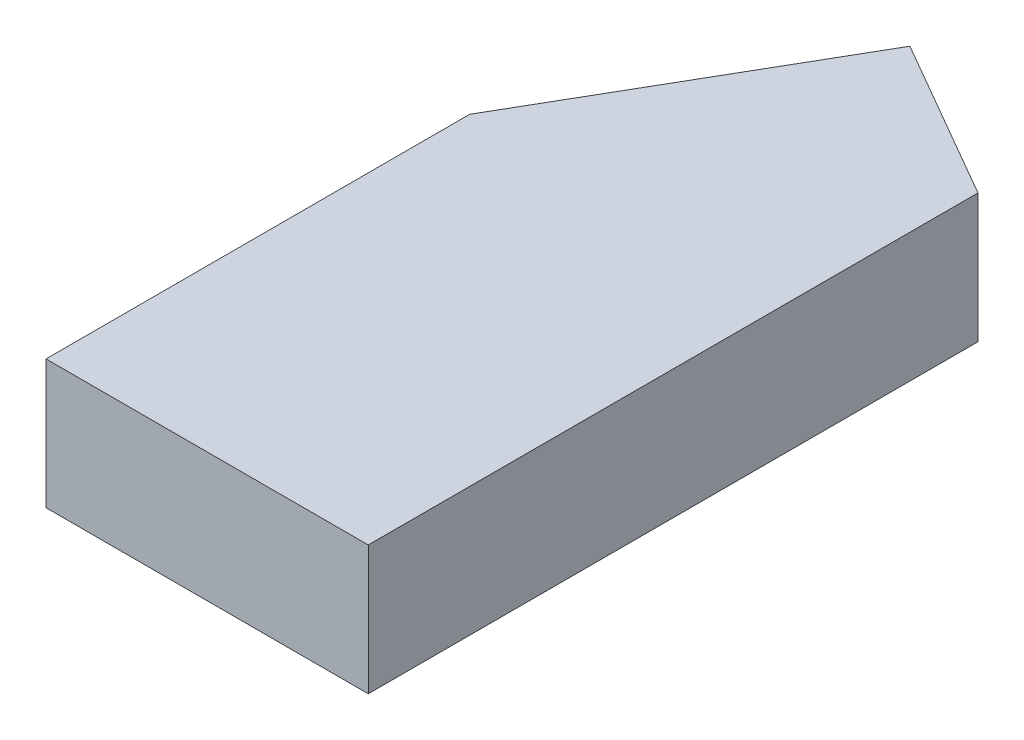
ISO-10303-21;
HEADER;
FILE_DESCRIPTION(('STEP AP214'),'2;1');
FILE_NAME('part.step','',(''),(''),'','','');
FILE_SCHEMA(('AUTOMOTIVE_DESIGN { 1 0 10303 214 1 1 1 1 }'));
ENDSEC;
DATA;
#1=APPLICATION_CONTEXT('core data for automotive mechanical design processes');
#2=APPLICATION_PROTOCOL_DEFINITION('international standard','automotive_design',2000,#1);
#3=PRODUCT_CONTEXT('',#1,'mechanical');
#4=PRODUCT('Part','Part','',(#3));
#5=PRODUCT_RELATED_PRODUCT_CATEGORY('part','',(#4));
#6=PRODUCT_DEFINITION_FORMATION('','',#4);
#7=PRODUCT_DEFINITION_CONTEXT('part definition',#1,'design');
#8=PRODUCT_DEFINITION('design','',#6,#7);
#9=PRODUCT_DEFINITION_SHAPE('','',#8);
#10=(LENGTH_UNIT() NAMED_UNIT(*) SI_UNIT(.MILLI.,.METRE.));
#11=(NAMED_UNIT(*) PLANE_ANGLE_UNIT() SI_UNIT($,.RADIAN.));
#12=(NAMED_UNIT(*) SI_UNIT($,.STERADIAN.) SOLID_ANGLE_UNIT());
#13=UNCERTAINTY_MEASURE_WITH_UNIT(LENGTH_MEASURE(1.E-05),#10,'distance_accuracy_value','');
#14=(GEOMETRIC_REPRESENTATION_CONTEXT(3) GLOBAL_UNCERTAINTY_ASSIGNED_CONTEXT((#13)) GLOBAL_UNIT_ASSIGNED_CONTEXT((#10,
#11,#12)) REPRESENTATION_CONTEXT('',''));
#15=CARTESIAN_POINT('',(0.,0.,0.));
#16=DIRECTION('',(0.,0.,1.));
#17=DIRECTION('',(1.,0.,0.));
#18=AXIS2_PLACEMENT_3D('',#15,#16,#17);
#19=CARTESIAN_POINT('',(59.9615242270666,10.,12.6850454237765));
#20=DIRECTION('',(0.,0.,-1.));
#21=DIRECTION('',(-1.,0.,0.));
#22=AXIS2_PLACEMENT_3D('',#19,#20,#21);
#23=PLANE('',#22);
#24=DIRECTION('',(1.,0.,0.));
#25=VECTOR('',#24,1.);
#26=CARTESIAN_POINT('',(59.9615242270666,0.,12.6850454237765));
#27=LINE('',#26,#25);
#28=CARTESIAN_POINT('',(34.9615242270666,0.,12.6850454237765));
#29=VERTEX_POINT('',#28);
#30=CARTESIAN_POINT('',(59.9615242270666,0.,12.6850454237765));
#31=VERTEX_POINT('',#30);
#32=EDGE_CURVE('E154',#29,#31,#27,.T.);
#33=ORIENTED_EDGE('',*,*,#32,.T.);
#34=DIRECTION('',(0.,-1.,0.));
#35=VECTOR('',#34,1.);
#36=CARTESIAN_POINT('',(59.9615242270666,10.,12.6850454237765));
#37=LINE('',#36,#35);
#38=CARTESIAN_POINT('',(59.9615242270666,10.,12.6850454237765));
#39=VERTEX_POINT('',#38);
#40=EDGE_CURVE('E12',#39,#31,#37,.T.);
#41=ORIENTED_EDGE('',*,*,#40,.F.);
#42=DIRECTION('',(1.,0.,0.));
#43=VECTOR('',#42,1.);
#44=CARTESIAN_POINT('',(59.9615242270666,10.,12.6850454237765));
#45=LINE('',#44,#43);
#46=CARTESIAN_POINT('',(34.9615242270666,10.,12.6850454237765));
#47=VERTEX_POINT('',#46);
#48=EDGE_CURVE('E133',#47,#39,#45,.T.);
#49=ORIENTED_EDGE('',*,*,#48,.F.);
#50=DIRECTION('',(0.,-1.,0.));
#51=VECTOR('',#50,1.);
#52=CARTESIAN_POINT('',(34.9615242270666,10.,12.6850454237765));
#53=LINE('',#52,#51);
#54=EDGE_CURVE('E121',#47,#29,#53,.T.);
#55=ORIENTED_EDGE('',*,*,#54,.T.);
#56=EDGE_LOOP('',(#33,#41,#49,#55));
#57=FACE_BOUND('',#56,.T.);
#58=ADVANCED_FACE('F46',(#57),#23,.F.);
#59=CARTESIAN_POINT('',(59.9615242270666,10.,12.6850454237765));
#60=DIRECTION('',(-1.,0.,0.));
#61=DIRECTION('',(0.,0.,1.));
#62=AXIS2_PLACEMENT_3D('',#59,#60,#61);
#63=PLANE('',#62);
#64=DIRECTION('',(0.,0.,-1.));
#65=VECTOR('',#64,1.);
#66=CARTESIAN_POINT('',(59.9615242270666,0.,12.6850454237765));
#67=LINE('',#66,#65);
#68=CARTESIAN_POINT('',(59.9615242270666,0.,-34.6188021535172));
#69=VERTEX_POINT('',#68);
#70=EDGE_CURVE('E151',#31,#69,#67,.T.);
#71=ORIENTED_EDGE('',*,*,#70,.T.);
#72=DIRECTION('',(0.,-1.,0.));
#73=VECTOR('',#72,1.);
#74=CARTESIAN_POINT('',(59.9615242270666,10.,-34.6188021535172));
#75=LINE('',#74,#73);
#76=CARTESIAN_POINT('',(59.9615242270666,10.,-34.6188021535172));
#77=VERTEX_POINT('',#76);
#78=EDGE_CURVE('E55',#77,#69,#75,.T.);
#79=ORIENTED_EDGE('',*,*,#78,.F.);
#80=DIRECTION('',(0.,0.,-1.));
#81=VECTOR('',#80,1.);
#82=CARTESIAN_POINT('',(59.9615242270666,10.,12.6850454237765));
#83=LINE('',#82,#81);
#84=EDGE_CURVE('E97',#39,#77,#83,.T.);
#85=ORIENTED_EDGE('',*,*,#84,.F.);
#86=ORIENTED_EDGE('',*,*,#40,.T.);
#87=EDGE_LOOP('',(#71,#79,#85,#86));
#88=FACE_BOUND('',#87,.T.);
#89=ADVANCED_FACE('F170',(#88),#63,.F.);
#90=CARTESIAN_POINT('',(59.9615242270666,10.,-34.6188021535172));
#91=DIRECTION('',(-0.499999999999997,0.,0.86602540378444));
#92=DIRECTION('',(0.86602540378444,0.,0.499999999999997));
#93=AXIS2_PLACEMENT_3D('',#90,#91,#92);
#94=PLANE('',#93);
#95=DIRECTION('',(-0.86602540378444,0.,-0.499999999999997));
#96=VECTOR('',#95,1.);
#97=CARTESIAN_POINT('',(59.9615242270666,0.,-34.6188021535172));
#98=LINE('',#97,#96);
#99=CARTESIAN_POINT('',(47.4615242270665,0.,-41.8356805183876));
#100=VERTEX_POINT('',#99);
#101=EDGE_CURVE('E113',#69,#100,#98,.T.);
#102=ORIENTED_EDGE('',*,*,#101,.T.);
#103=DIRECTION('',(0.,-1.,0.));
#104=VECTOR('',#103,1.);
#105=CARTESIAN_POINT('',(47.4615242270665,10.,-41.8356805183876));
#106=LINE('',#105,#104);
#107=CARTESIAN_POINT('',(47.4615242270665,10.,-41.8356805183876));
#108=VERTEX_POINT('',#107);
#109=EDGE_CURVE('E110',#108,#100,#106,.T.);
#110=ORIENTED_EDGE('',*,*,#109,.F.);
#111=DIRECTION('',(-0.86602540378444,0.,-0.499999999999997));
#112=VECTOR('',#111,1.);
#113=CARTESIAN_POINT('',(59.9615242270666,10.,-34.6188021535172));
#114=LINE('',#113,#112);
#115=EDGE_CURVE('E101',#77,#108,#114,.T.);
#116=ORIENTED_EDGE('',*,*,#115,.F.);
#117=ORIENTED_EDGE('',*,*,#78,.T.);
#118=EDGE_LOOP('',(#102,#110,#116,#117));
#119=FACE_BOUND('',#118,.T.);
#120=ADVANCED_FACE('F111',(#119),#94,.F.);
#121=CARTESIAN_POINT('',(34.9615242270666,10.,-20.1850454237766));
#122=DIRECTION('',(0.86602540378444,0.,0.499999999999998));
#123=DIRECTION('',(0.499999999999998,0.,-0.86602540378444));
#124=AXIS2_PLACEMENT_3D('',#121,#122,#123);
#125=PLANE('',#124);
#126=DIRECTION('',(-0.499999999999998,0.,0.86602540378444));
#127=VECTOR('',#126,1.);
#128=CARTESIAN_POINT('',(34.9615242270666,0.,-20.1850454237766));
#129=LINE('',#128,#127);
#130=CARTESIAN_POINT('',(34.9615242270666,0.,-20.1850454237766));
#131=VERTEX_POINT('',#130);
#132=EDGE_CURVE('E83',#100,#131,#129,.T.);
#133=ORIENTED_EDGE('',*,*,#132,.T.);
#134=DIRECTION('',(0.,-1.,0.));
#135=VECTOR('',#134,1.);
#136=CARTESIAN_POINT('',(34.9615242270666,10.,-20.1850454237766));
#137=LINE('',#136,#135);
#138=CARTESIAN_POINT('',(34.9615242270666,10.,-20.1850454237766));
#139=VERTEX_POINT('',#138);
#140=EDGE_CURVE('E115',#139,#131,#137,.T.);
#141=ORIENTED_EDGE('',*,*,#140,.F.);
#142=DIRECTION('',(-0.499999999999998,0.,0.86602540378444));
#143=VECTOR('',#142,1.);
#144=CARTESIAN_POINT('',(34.9615242270666,10.,-20.1850454237766));
#145=LINE('',#144,#143);
#146=EDGE_CURVE('E105',#108,#139,#145,.T.);
#147=ORIENTED_EDGE('',*,*,#146,.F.);
#148=ORIENTED_EDGE('',*,*,#109,.T.);
#149=EDGE_LOOP('',(#133,#141,#147,#148));
#150=FACE_BOUND('',#149,.T.);
#151=ADVANCED_FACE('F117',(#150),#125,.F.);
#152=CARTESIAN_POINT('',(34.9615242270666,10.,12.6850454237765));
#153=DIRECTION('',(1.,0.,0.));
#154=DIRECTION('',(0.,0.,-1.));
#155=AXIS2_PLACEMENT_3D('',#152,#153,#154);
#156=PLANE('',#155);
#157=DIRECTION('',(0.,0.,1.));
#158=VECTOR('',#157,1.);
#159=CARTESIAN_POINT('',(34.9615242270666,0.,12.6850454237765));
#160=LINE('',#159,#158);
#161=EDGE_CURVE('E89',#131,#29,#160,.T.);
#162=ORIENTED_EDGE('',*,*,#161,.T.);
#163=ORIENTED_EDGE('',*,*,#54,.F.);
#164=DIRECTION('',(0.,0.,1.));
#165=VECTOR('',#164,1.);
#166=CARTESIAN_POINT('',(34.9615242270666,10.,12.6850454237765));
#167=LINE('',#166,#165);
#168=EDGE_CURVE('E63',#139,#47,#167,.T.);
#169=ORIENTED_EDGE('',*,*,#168,.F.);
#170=ORIENTED_EDGE('',*,*,#140,.T.);
#171=EDGE_LOOP('',(#162,#163,#169,#170));
#172=FACE_BOUND('',#171,.T.);
#173=ADVANCED_FACE('F159',(#172),#156,.F.);
#174=CARTESIAN_POINT('',(0.,10.,0.));
#175=DIRECTION('',(0.,-1.,0.));
#176=DIRECTION('',(0.,0.,-1.));
#177=AXIS2_PLACEMENT_3D('',#174,#175,#176);
#178=PLANE('',#177);
#179=ORIENTED_EDGE('',*,*,#48,.T.);
#180=ORIENTED_EDGE('',*,*,#84,.T.);
#181=ORIENTED_EDGE('',*,*,#115,.T.);
#182=ORIENTED_EDGE('',*,*,#146,.T.);
#183=ORIENTED_EDGE('',*,*,#168,.T.);
#184=EDGE_LOOP('',(#179,#180,#181,#182,#183));
#185=FACE_BOUND('',#184,.T.);
#186=ADVANCED_FACE('F103',(#185),#178,.F.);
#187=CARTESIAN_POINT('',(0.,0.,0.));
#188=DIRECTION('',(0.,-1.,0.));
#189=DIRECTION('',(0.,0.,-1.));
#190=AXIS2_PLACEMENT_3D('',#187,#188,#189);
#191=PLANE('',#190);
#192=ORIENTED_EDGE('',*,*,#32,.F.);
#193=ORIENTED_EDGE('',*,*,#161,.F.);
#194=ORIENTED_EDGE('',*,*,#132,.F.);
#195=ORIENTED_EDGE('',*,*,#101,.F.);
#196=ORIENTED_EDGE('',*,*,#70,.F.);
#197=EDGE_LOOP('',(#192,#193,#194,#195,#196));
#198=FACE_BOUND('',#197,.T.);
#199=ADVANCED_FACE('F150',(#198),#191,.T.);
#200=CLOSED_SHELL('',(#58,#89,#120,#151,#173,#186,#199));
#201=MANIFOLD_SOLID_BREP('B2',#200);
#202=ADVANCED_BREP_SHAPE_REPRESENTATION('',(#18,#201),#14);
#203=SHAPE_DEFINITION_REPRESENTATION(#9,#202);
ENDSEC;
END-ISO-10303-21;
